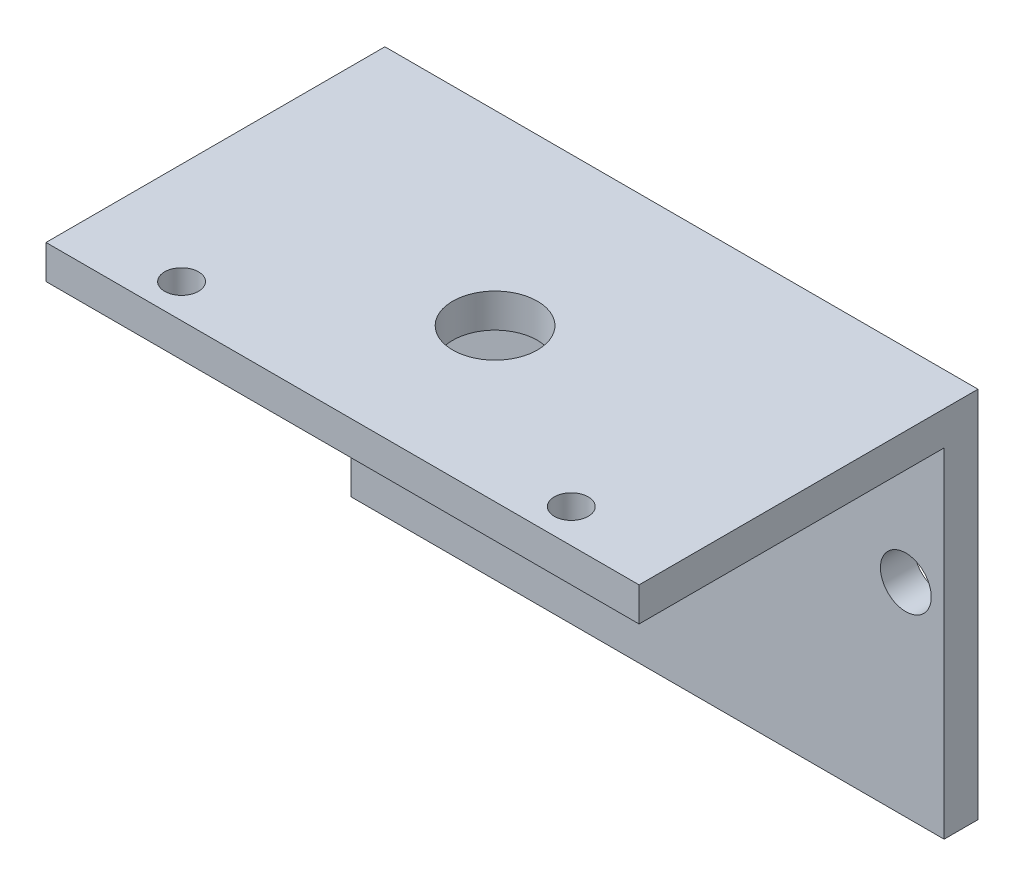
ISO-10303-21;
HEADER;
FILE_DESCRIPTION(('STEP AP214'),'2;1');
FILE_NAME('part.step','',(''),(''),'','','');
FILE_SCHEMA(('AUTOMOTIVE_DESIGN { 1 0 10303 214 1 1 1 1 }'));
ENDSEC;
DATA;
#1=APPLICATION_CONTEXT('core data for automotive mechanical design processes');
#2=APPLICATION_PROTOCOL_DEFINITION('international standard','automotive_design',2000,#1);
#3=PRODUCT_CONTEXT('',#1,'mechanical');
#4=PRODUCT('Part','Part','',(#3));
#5=PRODUCT_RELATED_PRODUCT_CATEGORY('part','',(#4));
#6=PRODUCT_DEFINITION_FORMATION('','',#4);
#7=PRODUCT_DEFINITION_CONTEXT('part definition',#1,'design');
#8=PRODUCT_DEFINITION('design','',#6,#7);
#9=PRODUCT_DEFINITION_SHAPE('','',#8);
#10=(LENGTH_UNIT() NAMED_UNIT(*) SI_UNIT(.MILLI.,.METRE.));
#11=(NAMED_UNIT(*) PLANE_ANGLE_UNIT() SI_UNIT($,.RADIAN.));
#12=(NAMED_UNIT(*) SI_UNIT($,.STERADIAN.) SOLID_ANGLE_UNIT());
#13=UNCERTAINTY_MEASURE_WITH_UNIT(LENGTH_MEASURE(1.E-05),#10,'distance_accuracy_value','');
#14=(GEOMETRIC_REPRESENTATION_CONTEXT(3) GLOBAL_UNCERTAINTY_ASSIGNED_CONTEXT((#13)) GLOBAL_UNIT_ASSIGNED_CONTEXT((#10,
#11,#12)) REPRESENTATION_CONTEXT('',''));
#15=CARTESIAN_POINT('',(0.,0.,0.));
#16=DIRECTION('',(0.,0.,1.));
#17=DIRECTION('',(1.,0.,0.));
#18=AXIS2_PLACEMENT_3D('',#15,#16,#17);
#19=CARTESIAN_POINT('',(17.5,2.,10.));
#20=DIRECTION('',(-1.,0.,0.));
#21=DIRECTION('',(0.,0.,1.));
#22=AXIS2_PLACEMENT_3D('',#19,#20,#21);
#23=PLANE('',#22);
#24=DIRECTION('',(0.,0.,-1.));
#25=VECTOR('',#24,1.);
#26=CARTESIAN_POINT('',(17.5,0.,10.));
#27=LINE('',#26,#25);
#28=CARTESIAN_POINT('',(17.5,0.,10.));
#29=VERTEX_POINT('',#28);
#30=CARTESIAN_POINT('',(17.5,0.,-8.));
#31=VERTEX_POINT('',#30);
#32=EDGE_CURVE('E149',#29,#31,#27,.T.);
#33=ORIENTED_EDGE('',*,*,#32,.T.);
#34=DIRECTION('',(0.,1.,0.));
#35=VECTOR('',#34,1.);
#36=CARTESIAN_POINT('',(17.5,-20.,-8.));
#37=LINE('',#36,#35);
#38=CARTESIAN_POINT('',(17.5,-20.,-8.));
#39=VERTEX_POINT('',#38);
#40=EDGE_CURVE('E145',#39,#31,#37,.T.);
#41=ORIENTED_EDGE('',*,*,#40,.F.);
#42=DIRECTION('',(0.,0.,1.));
#43=VECTOR('',#42,1.);
#44=CARTESIAN_POINT('',(17.5,-20.,-10.));
#45=LINE('',#44,#43);
#46=CARTESIAN_POINT('',(17.5,-20.,-10.));
#47=VERTEX_POINT('',#46);
#48=EDGE_CURVE('E124',#47,#39,#45,.T.);
#49=ORIENTED_EDGE('',*,*,#48,.F.);
#50=DIRECTION('',(0.,-1.,0.));
#51=VECTOR('',#50,1.);
#52=CARTESIAN_POINT('',(17.5,2.,-10.));
#53=LINE('',#52,#51);
#54=CARTESIAN_POINT('',(17.5,2.,-10.));
#55=VERTEX_POINT('',#54);
#56=EDGE_CURVE('E11',#55,#47,#53,.T.);
#57=ORIENTED_EDGE('',*,*,#56,.F.);
#58=DIRECTION('',(0.,0.,-1.));
#59=VECTOR('',#58,1.);
#60=CARTESIAN_POINT('',(17.5,2.,10.));
#61=LINE('',#60,#59);
#62=CARTESIAN_POINT('',(17.5,2.,10.));
#63=VERTEX_POINT('',#62);
#64=EDGE_CURVE('E150',#63,#55,#61,.T.);
#65=ORIENTED_EDGE('',*,*,#64,.F.);
#66=DIRECTION('',(0.,-1.,0.));
#67=VECTOR('',#66,1.);
#68=CARTESIAN_POINT('',(17.5,2.,10.));
#69=LINE('',#68,#67);
#70=EDGE_CURVE('E159',#63,#29,#69,.T.);
#71=ORIENTED_EDGE('',*,*,#70,.T.);
#72=EDGE_LOOP('',(#33,#41,#49,#57,#65,#71));
#73=FACE_BOUND('',#72,.T.);
#74=ADVANCED_FACE('F43',(#73),#23,.F.);
#75=CARTESIAN_POINT('',(-17.5,2.,-10.));
#76=DIRECTION('',(0.,0.,1.));
#77=DIRECTION('',(1.,0.,0.));
#78=AXIS2_PLACEMENT_3D('',#75,#76,#77);
#79=PLANE('',#78);
#80=CARTESIAN_POINT('',(15.2405651976411,-8.,-10.));
#81=DIRECTION('',(0.,0.,-1.));
#82=DIRECTION('',(-1.,0.,0.));
#83=AXIS2_PLACEMENT_3D('',#80,#81,#82);
#84=CIRCLE('',#83,1.5);
#85=CARTESIAN_POINT('',(13.7405651976411,-8.,-10.));
#86=VERTEX_POINT('',#85);
#87=EDGE_CURVE('E173',#86,#86,#84,.T.);
#88=ORIENTED_EDGE('',*,*,#87,.F.);
#89=EDGE_LOOP('',(#88));
#90=FACE_BOUND('',#89,.T.);
#91=CARTESIAN_POINT('',(-15.4432322880352,-8.,-10.));
#92=DIRECTION('',(0.,0.,-1.));
#93=DIRECTION('',(-1.,0.,0.));
#94=AXIS2_PLACEMENT_3D('',#91,#92,#93);
#95=CIRCLE('',#94,1.5);
#96=CARTESIAN_POINT('',(-16.9432322880352,-8.,-10.));
#97=VERTEX_POINT('',#96);
#98=EDGE_CURVE('E135',#97,#97,#95,.T.);
#99=ORIENTED_EDGE('',*,*,#98,.F.);
#100=EDGE_LOOP('',(#99));
#101=FACE_BOUND('',#100,.T.);
#102=ORIENTED_EDGE('',*,*,#56,.T.);
#103=DIRECTION('',(1.,0.,0.));
#104=VECTOR('',#103,1.);
#105=CARTESIAN_POINT('',(-17.5,-20.,-10.));
#106=LINE('',#105,#104);
#107=CARTESIAN_POINT('',(-17.5,-20.,-10.));
#108=VERTEX_POINT('',#107);
#109=EDGE_CURVE('E118',#108,#47,#106,.T.);
#110=ORIENTED_EDGE('',*,*,#109,.F.);
#111=DIRECTION('',(0.,-1.,0.));
#112=VECTOR('',#111,1.);
#113=CARTESIAN_POINT('',(-17.5,2.,-10.));
#114=LINE('',#113,#112);
#115=CARTESIAN_POINT('',(-17.5,2.,-10.));
#116=VERTEX_POINT('',#115);
#117=EDGE_CURVE('E52',#116,#108,#114,.T.);
#118=ORIENTED_EDGE('',*,*,#117,.F.);
#119=DIRECTION('',(-1.,0.,0.));
#120=VECTOR('',#119,1.);
#121=CARTESIAN_POINT('',(-17.5,2.,-10.));
#122=LINE('',#121,#120);
#123=EDGE_CURVE('E91',#55,#116,#122,.T.);
#124=ORIENTED_EDGE('',*,*,#123,.F.);
#125=EDGE_LOOP('',(#102,#110,#118,#124));
#126=FACE_BOUND('',#125,.T.);
#127=ADVANCED_FACE('F119',(#90,#101,#126),#79,.F.);
#128=CARTESIAN_POINT('',(-17.5,2.,10.));
#129=DIRECTION('',(1.,0.,0.));
#130=DIRECTION('',(0.,0.,-1.));
#131=AXIS2_PLACEMENT_3D('',#128,#129,#130);
#132=PLANE('',#131);
#133=ORIENTED_EDGE('',*,*,#117,.T.);
#134=DIRECTION('',(0.,0.,-1.));
#135=VECTOR('',#134,1.);
#136=CARTESIAN_POINT('',(-17.5,-20.,-10.));
#137=LINE('',#136,#135);
#138=CARTESIAN_POINT('',(-17.5,-20.,-8.));
#139=VERTEX_POINT('',#138);
#140=EDGE_CURVE('E111',#139,#108,#137,.T.);
#141=ORIENTED_EDGE('',*,*,#140,.F.);
#142=DIRECTION('',(0.,1.,0.));
#143=VECTOR('',#142,1.);
#144=CARTESIAN_POINT('',(-17.5,-20.,-8.));
#145=LINE('',#144,#143);
#146=CARTESIAN_POINT('',(-17.5,0.,-8.));
#147=VERTEX_POINT('',#146);
#148=EDGE_CURVE('E141',#139,#147,#145,.T.);
#149=ORIENTED_EDGE('',*,*,#148,.T.);
#150=DIRECTION('',(0.,0.,1.));
#151=VECTOR('',#150,1.);
#152=CARTESIAN_POINT('',(-17.5,0.,10.));
#153=LINE('',#152,#151);
#154=CARTESIAN_POINT('',(-17.5,0.,10.));
#155=VERTEX_POINT('',#154);
#156=EDGE_CURVE('E162',#147,#155,#153,.T.);
#157=ORIENTED_EDGE('',*,*,#156,.T.);
#158=DIRECTION('',(0.,-1.,0.));
#159=VECTOR('',#158,1.);
#160=CARTESIAN_POINT('',(-17.5,2.,10.));
#161=LINE('',#160,#159);
#162=CARTESIAN_POINT('',(-17.5,2.,10.));
#163=VERTEX_POINT('',#162);
#164=EDGE_CURVE('E115',#163,#155,#161,.T.);
#165=ORIENTED_EDGE('',*,*,#164,.F.);
#166=DIRECTION('',(0.,0.,1.));
#167=VECTOR('',#166,1.);
#168=CARTESIAN_POINT('',(-17.5,2.,10.));
#169=LINE('',#168,#167);
#170=EDGE_CURVE('E113',#116,#163,#169,.T.);
#171=ORIENTED_EDGE('',*,*,#170,.F.);
#172=EDGE_LOOP('',(#133,#141,#149,#157,#165,#171));
#173=FACE_BOUND('',#172,.T.);
#174=ADVANCED_FACE('F108',(#173),#132,.F.);
#175=CARTESIAN_POINT('',(-17.5,2.,10.));
#176=DIRECTION('',(0.,0.,-1.));
#177=DIRECTION('',(-1.,0.,0.));
#178=AXIS2_PLACEMENT_3D('',#175,#176,#177);
#179=PLANE('',#178);
#180=DIRECTION('',(1.,0.,0.));
#181=VECTOR('',#180,1.);
#182=CARTESIAN_POINT('',(-17.5,0.,10.));
#183=LINE('',#182,#181);
#184=EDGE_CURVE('E84',#155,#29,#183,.T.);
#185=ORIENTED_EDGE('',*,*,#184,.T.);
#186=ORIENTED_EDGE('',*,*,#70,.F.);
#187=DIRECTION('',(1.,0.,0.));
#188=VECTOR('',#187,1.);
#189=CARTESIAN_POINT('',(-17.5,2.,10.));
#190=LINE('',#189,#188);
#191=EDGE_CURVE('E69',#163,#63,#190,.T.);
#192=ORIENTED_EDGE('',*,*,#191,.F.);
#193=ORIENTED_EDGE('',*,*,#164,.T.);
#194=EDGE_LOOP('',(#185,#186,#192,#193));
#195=FACE_BOUND('',#194,.T.);
#196=ADVANCED_FACE('F232',(#195),#179,.F.);
#197=CARTESIAN_POINT('',(0.,2.,0.));
#198=DIRECTION('',(0.,-1.,0.));
#199=DIRECTION('',(0.,0.,-1.));
#200=AXIS2_PLACEMENT_3D('',#197,#198,#199);
#201=PLANE('',#200);
#202=CARTESIAN_POINT('',(0.,2.,1.));
#203=DIRECTION('',(0.,-1.,0.));
#204=DIRECTION('',(0.,0.,-1.));
#205=AXIS2_PLACEMENT_3D('',#202,#203,#204);
#206=CIRCLE('',#205,2.5);
#207=CARTESIAN_POINT('',(0.,2.,-1.5));
#208=VERTEX_POINT('',#207);
#209=EDGE_CURVE('E198',#208,#208,#206,.T.);
#210=ORIENTED_EDGE('',*,*,#209,.T.);
#211=EDGE_LOOP('',(#210));
#212=FACE_BOUND('',#211,.T.);
#213=CARTESIAN_POINT('',(-11.5,2.,8.));
#214=DIRECTION('',(0.,-1.,0.));
#215=DIRECTION('',(0.,0.,-1.));
#216=AXIS2_PLACEMENT_3D('',#213,#214,#215);
#217=CIRCLE('',#216,1.);
#218=CARTESIAN_POINT('',(-11.5,2.,7.));
#219=VERTEX_POINT('',#218);
#220=EDGE_CURVE('E184',#219,#219,#217,.T.);
#221=ORIENTED_EDGE('',*,*,#220,.T.);
#222=EDGE_LOOP('',(#221));
#223=FACE_BOUND('',#222,.T.);
#224=CARTESIAN_POINT('',(11.5,2.,8.));
#225=DIRECTION('',(0.,-1.,0.));
#226=DIRECTION('',(0.,0.,-1.));
#227=AXIS2_PLACEMENT_3D('',#224,#225,#226);
#228=CIRCLE('',#227,1.);
#229=CARTESIAN_POINT('',(11.5,2.,7.));
#230=VERTEX_POINT('',#229);
#231=EDGE_CURVE('E189',#230,#230,#228,.T.);
#232=ORIENTED_EDGE('',*,*,#231,.T.);
#233=EDGE_LOOP('',(#232));
#234=FACE_BOUND('',#233,.T.);
#235=ORIENTED_EDGE('',*,*,#64,.T.);
#236=ORIENTED_EDGE('',*,*,#123,.T.);
#237=ORIENTED_EDGE('',*,*,#170,.T.);
#238=ORIENTED_EDGE('',*,*,#191,.T.);
#239=EDGE_LOOP('',(#235,#236,#237,#238));
#240=FACE_BOUND('',#239,.T.);
#241=ADVANCED_FACE('F217',(#212,#223,#234,#240),#201,.F.);
#242=CARTESIAN_POINT('',(0.,0.,0.));
#243=DIRECTION('',(0.,-1.,0.));
#244=DIRECTION('',(0.,0.,-1.));
#245=AXIS2_PLACEMENT_3D('',#242,#243,#244);
#246=PLANE('',#245);
#247=CARTESIAN_POINT('',(0.,0.,1.));
#248=DIRECTION('',(0.,-1.,0.));
#249=DIRECTION('',(0.,0.,-1.));
#250=AXIS2_PLACEMENT_3D('',#247,#248,#249);
#251=CIRCLE('',#250,2.5);
#252=CARTESIAN_POINT('',(0.,0.,-1.5));
#253=VERTEX_POINT('',#252);
#254=EDGE_CURVE('E205',#253,#253,#251,.T.);
#255=ORIENTED_EDGE('',*,*,#254,.F.);
#256=EDGE_LOOP('',(#255));
#257=FACE_BOUND('',#256,.T.);
#258=CARTESIAN_POINT('',(-11.5,0.,8.));
#259=DIRECTION('',(0.,-1.,0.));
#260=DIRECTION('',(0.,0.,-1.));
#261=AXIS2_PLACEMENT_3D('',#258,#259,#260);
#262=CIRCLE('',#261,1.);
#263=CARTESIAN_POINT('',(-11.5,0.,7.));
#264=VERTEX_POINT('',#263);
#265=EDGE_CURVE('E193',#264,#264,#262,.T.);
#266=ORIENTED_EDGE('',*,*,#265,.F.);
#267=EDGE_LOOP('',(#266));
#268=FACE_BOUND('',#267,.T.);
#269=CARTESIAN_POINT('',(11.5,0.,8.));
#270=DIRECTION('',(0.,-1.,0.));
#271=DIRECTION('',(0.,0.,-1.));
#272=AXIS2_PLACEMENT_3D('',#269,#270,#271);
#273=CIRCLE('',#272,1.);
#274=CARTESIAN_POINT('',(11.5,0.,7.));
#275=VERTEX_POINT('',#274);
#276=EDGE_CURVE('E194',#275,#275,#273,.T.);
#277=ORIENTED_EDGE('',*,*,#276,.F.);
#278=EDGE_LOOP('',(#277));
#279=FACE_BOUND('',#278,.T.);
#280=DIRECTION('',(-1.,0.,0.));
#281=VECTOR('',#280,1.);
#282=CARTESIAN_POINT('',(-17.5,0.,-8.));
#283=LINE('',#282,#281);
#284=EDGE_CURVE('E60',#31,#147,#283,.T.);
#285=ORIENTED_EDGE('',*,*,#284,.F.);
#286=ORIENTED_EDGE('',*,*,#32,.F.);
#287=ORIENTED_EDGE('',*,*,#184,.F.);
#288=ORIENTED_EDGE('',*,*,#156,.F.);
#289=EDGE_LOOP('',(#285,#286,#287,#288));
#290=FACE_BOUND('',#289,.T.);
#291=ADVANCED_FACE('F213',(#257,#268,#279,#290),#246,.T.);
#292=CARTESIAN_POINT('',(-17.5,-20.,-8.));
#293=DIRECTION('',(0.,0.,-1.));
#294=DIRECTION('',(-1.,0.,0.));
#295=AXIS2_PLACEMENT_3D('',#292,#293,#294);
#296=PLANE('',#295);
#297=CARTESIAN_POINT('',(15.2405651976411,-8.,-8.));
#298=DIRECTION('',(0.,0.,-1.));
#299=DIRECTION('',(-1.,0.,0.));
#300=AXIS2_PLACEMENT_3D('',#297,#298,#299);
#301=CIRCLE('',#300,1.5);
#302=CARTESIAN_POINT('',(13.7405651976411,-8.,-8.));
#303=VERTEX_POINT('',#302);
#304=EDGE_CURVE('E46',#303,#303,#301,.T.);
#305=ORIENTED_EDGE('',*,*,#304,.T.);
#306=EDGE_LOOP('',(#305));
#307=FACE_BOUND('',#306,.T.);
#308=CARTESIAN_POINT('',(-15.4432322880352,-8.,-8.));
#309=DIRECTION('',(0.,0.,-1.));
#310=DIRECTION('',(-1.,0.,0.));
#311=AXIS2_PLACEMENT_3D('',#308,#309,#310);
#312=CIRCLE('',#311,1.5);
#313=CARTESIAN_POINT('',(-16.9432322880352,-8.,-8.));
#314=VERTEX_POINT('',#313);
#315=EDGE_CURVE('E170',#314,#314,#312,.T.);
#316=ORIENTED_EDGE('',*,*,#315,.T.);
#317=EDGE_LOOP('',(#316));
#318=FACE_BOUND('',#317,.T.);
#319=ORIENTED_EDGE('',*,*,#284,.T.);
#320=ORIENTED_EDGE('',*,*,#148,.F.);
#321=DIRECTION('',(-1.,0.,0.));
#322=VECTOR('',#321,1.);
#323=CARTESIAN_POINT('',(-17.5,-20.,-8.));
#324=LINE('',#323,#322);
#325=EDGE_CURVE('E128',#39,#139,#324,.T.);
#326=ORIENTED_EDGE('',*,*,#325,.F.);
#327=ORIENTED_EDGE('',*,*,#40,.T.);
#328=EDGE_LOOP('',(#319,#320,#326,#327));
#329=FACE_BOUND('',#328,.T.);
#330=ADVANCED_FACE('F216',(#307,#318,#329),#296,.F.);
#331=CARTESIAN_POINT('',(0.,-20.,0.));
#332=DIRECTION('',(0.,1.,0.));
#333=DIRECTION('',(0.,0.,1.));
#334=AXIS2_PLACEMENT_3D('',#331,#332,#333);
#335=PLANE('',#334);
#336=ORIENTED_EDGE('',*,*,#140,.T.);
#337=ORIENTED_EDGE('',*,*,#109,.T.);
#338=ORIENTED_EDGE('',*,*,#48,.T.);
#339=ORIENTED_EDGE('',*,*,#325,.T.);
#340=EDGE_LOOP('',(#336,#337,#338,#339));
#341=FACE_BOUND('',#340,.T.);
#342=ADVANCED_FACE('F126',(#341),#335,.F.);
#343=CARTESIAN_POINT('',(-15.4432322880352,-8.,10.));
#344=DIRECTION('',(0.,0.,-1.));
#345=DIRECTION('',(-1.,0.,0.));
#346=AXIS2_PLACEMENT_3D('',#343,#344,#345);
#347=CYLINDRICAL_SURFACE('',#346,1.5);
#348=ORIENTED_EDGE('',*,*,#98,.T.);
#349=EDGE_LOOP('',(#348));
#350=FACE_BOUND('',#349,.T.);
#351=ORIENTED_EDGE('',*,*,#315,.F.);
#352=EDGE_LOOP('',(#351));
#353=FACE_BOUND('',#352,.T.);
#354=ADVANCED_FACE('F255',(#350,#353),#347,.F.);
#355=CARTESIAN_POINT('',(15.2405651976411,-8.,10.));
#356=DIRECTION('',(0.,0.,-1.));
#357=DIRECTION('',(-1.,0.,0.));
#358=AXIS2_PLACEMENT_3D('',#355,#356,#357);
#359=CYLINDRICAL_SURFACE('',#358,1.5);
#360=ORIENTED_EDGE('',*,*,#87,.T.);
#361=EDGE_LOOP('',(#360));
#362=FACE_BOUND('',#361,.T.);
#363=ORIENTED_EDGE('',*,*,#304,.F.);
#364=EDGE_LOOP('',(#363));
#365=FACE_BOUND('',#364,.T.);
#366=ADVANCED_FACE('F227',(#362,#365),#359,.F.);
#367=CARTESIAN_POINT('',(11.5,20.,8.));
#368=DIRECTION('',(0.,-1.,0.));
#369=DIRECTION('',(0.,0.,-1.));
#370=AXIS2_PLACEMENT_3D('',#367,#368,#369);
#371=CYLINDRICAL_SURFACE('',#370,1.);
#372=ORIENTED_EDGE('',*,*,#276,.T.);
#373=EDGE_LOOP('',(#372));
#374=FACE_BOUND('',#373,.T.);
#375=ORIENTED_EDGE('',*,*,#231,.F.);
#376=EDGE_LOOP('',(#375));
#377=FACE_BOUND('',#376,.T.);
#378=ADVANCED_FACE('F223',(#374,#377),#371,.F.);
#379=CARTESIAN_POINT('',(-11.5,20.,8.));
#380=DIRECTION('',(0.,-1.,0.));
#381=DIRECTION('',(0.,0.,-1.));
#382=AXIS2_PLACEMENT_3D('',#379,#380,#381);
#383=CYLINDRICAL_SURFACE('',#382,1.);
#384=ORIENTED_EDGE('',*,*,#265,.T.);
#385=EDGE_LOOP('',(#384));
#386=FACE_BOUND('',#385,.T.);
#387=ORIENTED_EDGE('',*,*,#220,.F.);
#388=EDGE_LOOP('',(#387));
#389=FACE_BOUND('',#388,.T.);
#390=ADVANCED_FACE('F226',(#386,#389),#383,.F.);
#391=CARTESIAN_POINT('',(0.,20.,1.));
#392=DIRECTION('',(0.,-1.,0.));
#393=DIRECTION('',(0.,0.,-1.));
#394=AXIS2_PLACEMENT_3D('',#391,#392,#393);
#395=CYLINDRICAL_SURFACE('',#394,2.5);
#396=ORIENTED_EDGE('',*,*,#254,.T.);
#397=EDGE_LOOP('',(#396));
#398=FACE_BOUND('',#397,.T.);
#399=ORIENTED_EDGE('',*,*,#209,.F.);
#400=EDGE_LOOP('',(#399));
#401=FACE_BOUND('',#400,.T.);
#402=ADVANCED_FACE('F210',(#398,#401),#395,.F.);
#403=CLOSED_SHELL('',(#74,#127,#174,#196,#241,#291,#330,#342,#354,#366,#378,#390,#402));
#404=MANIFOLD_SOLID_BREP('B2',#403);
#405=ADVANCED_BREP_SHAPE_REPRESENTATION('',(#18,#404),#14);
#406=SHAPE_DEFINITION_REPRESENTATION(#9,#405);
ENDSEC;
END-ISO-10303-21;
